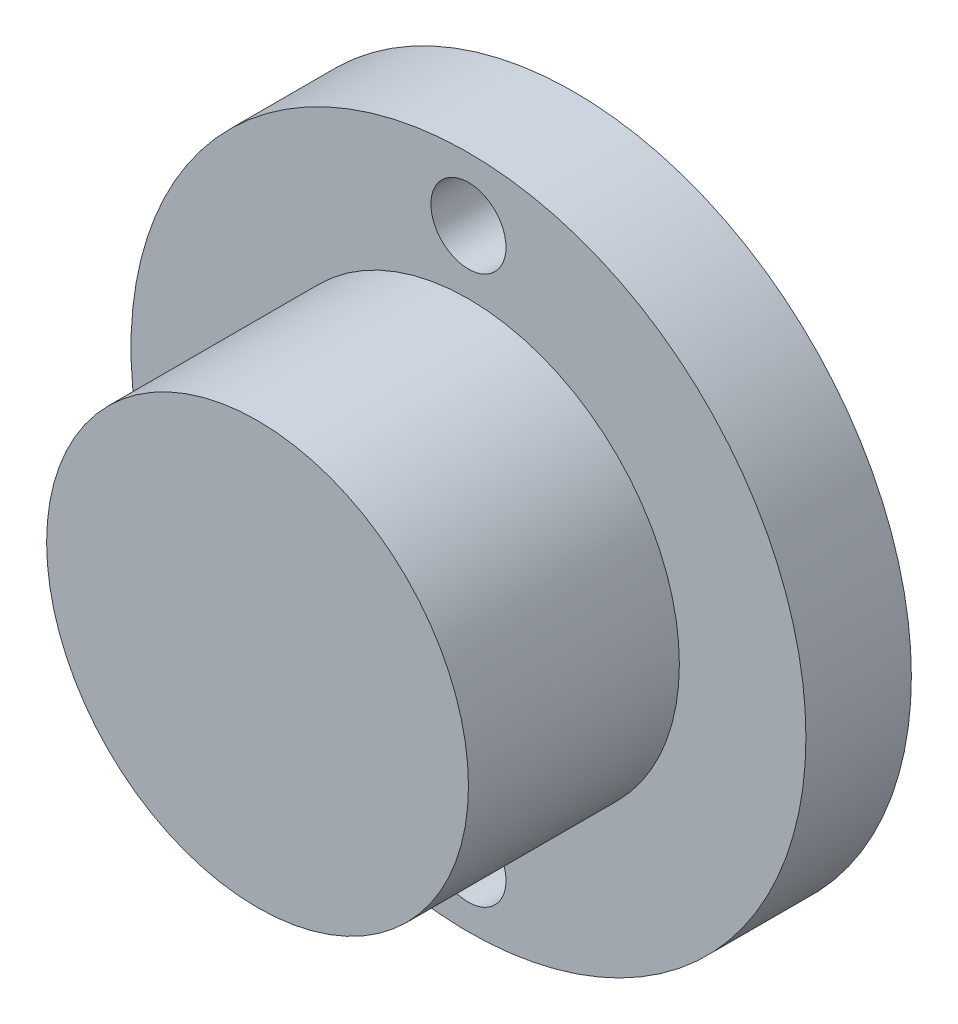
ISO-10303-21;
HEADER;
FILE_DESCRIPTION(('STEP AP214'),'2;1');
FILE_NAME('part.step','',(''),(''),'','','');
FILE_SCHEMA(('AUTOMOTIVE_DESIGN { 1 0 10303 214 1 1 1 1 }'));
ENDSEC;
DATA;
#1=APPLICATION_CONTEXT('core data for automotive mechanical design processes');
#2=APPLICATION_PROTOCOL_DEFINITION('international standard','automotive_design',2000,#1);
#3=PRODUCT_CONTEXT('',#1,'mechanical');
#4=PRODUCT('Part','Part','',(#3));
#5=PRODUCT_RELATED_PRODUCT_CATEGORY('part','',(#4));
#6=PRODUCT_DEFINITION_FORMATION('','',#4);
#7=PRODUCT_DEFINITION_CONTEXT('part definition',#1,'design');
#8=PRODUCT_DEFINITION('design','',#6,#7);
#9=PRODUCT_DEFINITION_SHAPE('','',#8);
#10=(LENGTH_UNIT() NAMED_UNIT(*) SI_UNIT(.MILLI.,.METRE.));
#11=(NAMED_UNIT(*) PLANE_ANGLE_UNIT() SI_UNIT($,.RADIAN.));
#12=(NAMED_UNIT(*) SI_UNIT($,.STERADIAN.) SOLID_ANGLE_UNIT());
#13=UNCERTAINTY_MEASURE_WITH_UNIT(LENGTH_MEASURE(1.E-05),#10,'distance_accuracy_value','');
#14=(GEOMETRIC_REPRESENTATION_CONTEXT(3) GLOBAL_UNCERTAINTY_ASSIGNED_CONTEXT((#13)) GLOBAL_UNIT_ASSIGNED_CONTEXT((#10,
#11,#12)) REPRESENTATION_CONTEXT('',''));
#15=CARTESIAN_POINT('',(0.,0.,0.));
#16=DIRECTION('',(0.,0.,1.));
#17=DIRECTION('',(1.,0.,0.));
#18=AXIS2_PLACEMENT_3D('',#15,#16,#17);
#19=CARTESIAN_POINT('',(0.,0.,3.175));
#20=DIRECTION('',(0.,0.,-1.));
#21=DIRECTION('',(-1.,0.,0.));
#22=AXIS2_PLACEMENT_3D('',#19,#20,#21);
#23=CYLINDRICAL_SURFACE('',#22,10.16);
#24=CARTESIAN_POINT('',(0.,0.,3.175));
#25=DIRECTION('',(0.,0.,1.));
#26=DIRECTION('',(1.,0.,0.));
#27=AXIS2_PLACEMENT_3D('',#24,#25,#26);
#28=CIRCLE('',#27,10.16);
#29=CARTESIAN_POINT('',(10.16,0.,3.175));
#30=VERTEX_POINT('',#29);
#31=EDGE_CURVE('E38',#30,#30,#28,.T.);
#32=ORIENTED_EDGE('',*,*,#31,.F.);
#33=EDGE_LOOP('',(#32));
#34=FACE_BOUND('',#33,.T.);
#35=CARTESIAN_POINT('',(0.,0.,0.));
#36=DIRECTION('',(0.,0.,1.));
#37=DIRECTION('',(1.,0.,0.));
#38=AXIS2_PLACEMENT_3D('',#35,#36,#37);
#39=CIRCLE('',#38,10.16);
#40=CARTESIAN_POINT('',(10.16,0.,0.));
#41=VERTEX_POINT('',#40);
#42=EDGE_CURVE('E34',#41,#41,#39,.T.);
#43=ORIENTED_EDGE('',*,*,#42,.T.);
#44=EDGE_LOOP('',(#43));
#45=FACE_BOUND('',#44,.T.);
#46=ADVANCED_FACE('F31',(#34,#45),#23,.T.);
#47=CARTESIAN_POINT('',(0.,0.,3.175));
#48=DIRECTION('',(0.,0.,1.));
#49=DIRECTION('',(1.,0.,0.));
#50=AXIS2_PLACEMENT_3D('',#47,#48,#49);
#51=PLANE('',#50);
#52=CARTESIAN_POINT('',(0.,8.255,3.175));
#53=DIRECTION('',(0.,0.,1.));
#54=DIRECTION('',(1.,0.,0.));
#55=AXIS2_PLACEMENT_3D('',#52,#53,#54);
#56=CIRCLE('',#55,1.1303);
#57=CARTESIAN_POINT('',(1.1303,8.255,3.175));
#58=VERTEX_POINT('',#57);
#59=EDGE_CURVE('E60',#58,#58,#56,.T.);
#60=ORIENTED_EDGE('',*,*,#59,.F.);
#61=EDGE_LOOP('',(#60));
#62=FACE_BOUND('',#61,.T.);
#63=CARTESIAN_POINT('',(0.,-8.255,3.175));
#64=DIRECTION('',(0.,0.,1.));
#65=DIRECTION('',(1.,0.,0.));
#66=AXIS2_PLACEMENT_3D('',#63,#64,#65);
#67=CIRCLE('',#66,1.1303);
#68=CARTESIAN_POINT('',(1.1303,-8.255,3.175));
#69=VERTEX_POINT('',#68);
#70=EDGE_CURVE('E54',#69,#69,#67,.T.);
#71=ORIENTED_EDGE('',*,*,#70,.F.);
#72=EDGE_LOOP('',(#71));
#73=FACE_BOUND('',#72,.T.);
#74=CARTESIAN_POINT('',(0.,0.,3.175));
#75=DIRECTION('',(0.,0.,1.));
#76=DIRECTION('',(1.,0.,0.));
#77=AXIS2_PLACEMENT_3D('',#74,#75,#76);
#78=CIRCLE('',#77,6.35);
#79=CARTESIAN_POINT('',(6.35,0.,3.175));
#80=VERTEX_POINT('',#79);
#81=EDGE_CURVE('E10',#80,#80,#78,.T.);
#82=ORIENTED_EDGE('',*,*,#81,.F.);
#83=EDGE_LOOP('',(#82));
#84=FACE_BOUND('',#83,.T.);
#85=ORIENTED_EDGE('',*,*,#31,.T.);
#86=EDGE_LOOP('',(#85));
#87=FACE_BOUND('',#86,.T.);
#88=ADVANCED_FACE('F76',(#62,#73,#84,#87),#51,.T.);
#89=CARTESIAN_POINT('',(0.,0.,0.));
#90=DIRECTION('',(0.,0.,1.));
#91=DIRECTION('',(1.,0.,0.));
#92=AXIS2_PLACEMENT_3D('',#89,#90,#91);
#93=PLANE('',#92);
#94=CARTESIAN_POINT('',(0.,8.255,0.));
#95=DIRECTION('',(0.,0.,1.));
#96=DIRECTION('',(1.,0.,0.));
#97=AXIS2_PLACEMENT_3D('',#94,#95,#96);
#98=CIRCLE('',#97,1.1303);
#99=CARTESIAN_POINT('',(1.1303,8.255,0.));
#100=VERTEX_POINT('',#99);
#101=EDGE_CURVE('E51',#100,#100,#98,.T.);
#102=ORIENTED_EDGE('',*,*,#101,.T.);
#103=EDGE_LOOP('',(#102));
#104=FACE_BOUND('',#103,.T.);
#105=CARTESIAN_POINT('',(0.,-8.255,0.));
#106=DIRECTION('',(0.,0.,1.));
#107=DIRECTION('',(1.,0.,0.));
#108=AXIS2_PLACEMENT_3D('',#105,#106,#107);
#109=CIRCLE('',#108,1.1303);
#110=CARTESIAN_POINT('',(1.1303,-8.255,0.));
#111=VERTEX_POINT('',#110);
#112=EDGE_CURVE('E57',#111,#111,#109,.T.);
#113=ORIENTED_EDGE('',*,*,#112,.T.);
#114=EDGE_LOOP('',(#113));
#115=FACE_BOUND('',#114,.T.);
#116=CARTESIAN_POINT('',(0.,0.,0.));
#117=DIRECTION('',(0.,0.,-1.));
#118=DIRECTION('',(-1.,0.,0.));
#119=AXIS2_PLACEMENT_3D('',#116,#117,#118);
#120=CIRCLE('',#119,4.7625);
#121=CARTESIAN_POINT('',(-4.7625,0.,0.));
#122=VERTEX_POINT('',#121);
#123=EDGE_CURVE('E48',#122,#122,#120,.T.);
#124=ORIENTED_EDGE('',*,*,#123,.F.);
#125=EDGE_LOOP('',(#124));
#126=FACE_BOUND('',#125,.T.);
#127=ORIENTED_EDGE('',*,*,#42,.F.);
#128=EDGE_LOOP('',(#127));
#129=FACE_BOUND('',#128,.T.);
#130=ADVANCED_FACE('F66',(#104,#115,#126,#129),#93,.F.);
#131=CARTESIAN_POINT('',(0.,0.,9.525));
#132=DIRECTION('',(0.,0.,-1.));
#133=DIRECTION('',(-1.,0.,0.));
#134=AXIS2_PLACEMENT_3D('',#131,#132,#133);
#135=CYLINDRICAL_SURFACE('',#134,6.35);
#136=CARTESIAN_POINT('',(0.,0.,9.525));
#137=DIRECTION('',(0.,0.,1.));
#138=DIRECTION('',(1.,0.,0.));
#139=AXIS2_PLACEMENT_3D('',#136,#137,#138);
#140=CIRCLE('',#139,6.35);
#141=CARTESIAN_POINT('',(6.35,0.,9.525));
#142=VERTEX_POINT('',#141);
#143=EDGE_CURVE('E44',#142,#142,#140,.T.);
#144=ORIENTED_EDGE('',*,*,#143,.F.);
#145=EDGE_LOOP('',(#144));
#146=FACE_BOUND('',#145,.T.);
#147=ORIENTED_EDGE('',*,*,#81,.T.);
#148=EDGE_LOOP('',(#147));
#149=FACE_BOUND('',#148,.T.);
#150=ADVANCED_FACE('F91',(#146,#149),#135,.T.);
#151=CARTESIAN_POINT('',(0.,0.,9.525));
#152=DIRECTION('',(0.,0.,1.));
#153=DIRECTION('',(1.,0.,0.));
#154=AXIS2_PLACEMENT_3D('',#151,#152,#153);
#155=PLANE('',#154);
#156=ORIENTED_EDGE('',*,*,#143,.T.);
#157=EDGE_LOOP('',(#156));
#158=FACE_BOUND('',#157,.T.);
#159=ADVANCED_FACE('F95',(#158),#155,.T.);
#160=CARTESIAN_POINT('',(0.,0.,6.35));
#161=DIRECTION('',(0.,0.,-1.));
#162=DIRECTION('',(-1.,0.,0.));
#163=AXIS2_PLACEMENT_3D('',#160,#161,#162);
#164=CYLINDRICAL_SURFACE('',#163,4.7625);
#165=CARTESIAN_POINT('',(0.,0.,6.35));
#166=DIRECTION('',(0.,0.,-1.));
#167=DIRECTION('',(-1.,0.,0.));
#168=AXIS2_PLACEMENT_3D('',#165,#166,#167);
#169=CIRCLE('',#168,4.7625);
#170=CARTESIAN_POINT('',(-4.7625,0.,6.35));
#171=VERTEX_POINT('',#170);
#172=EDGE_CURVE('E47',#171,#171,#169,.T.);
#173=ORIENTED_EDGE('',*,*,#172,.F.);
#174=EDGE_LOOP('',(#173));
#175=FACE_BOUND('',#174,.T.);
#176=ORIENTED_EDGE('',*,*,#123,.T.);
#177=EDGE_LOOP('',(#176));
#178=FACE_BOUND('',#177,.T.);
#179=ADVANCED_FACE('F101',(#175,#178),#164,.F.);
#180=CARTESIAN_POINT('',(0.,0.,6.35));
#181=DIRECTION('',(0.,0.,-1.));
#182=DIRECTION('',(-1.,0.,0.));
#183=AXIS2_PLACEMENT_3D('',#180,#181,#182);
#184=PLANE('',#183);
#185=ORIENTED_EDGE('',*,*,#172,.T.);
#186=EDGE_LOOP('',(#185));
#187=FACE_BOUND('',#186,.T.);
#188=ADVANCED_FACE('F105',(#187),#184,.T.);
#189=CARTESIAN_POINT('',(0.,-8.255,0.));
#190=DIRECTION('',(0.,0.,1.));
#191=DIRECTION('',(1.,0.,0.));
#192=AXIS2_PLACEMENT_3D('',#189,#190,#191);
#193=CYLINDRICAL_SURFACE('',#192,1.1303);
#194=ORIENTED_EDGE('',*,*,#112,.F.);
#195=EDGE_LOOP('',(#194));
#196=FACE_BOUND('',#195,.T.);
#197=ORIENTED_EDGE('',*,*,#70,.T.);
#198=EDGE_LOOP('',(#197));
#199=FACE_BOUND('',#198,.T.);
#200=ADVANCED_FACE('F72',(#196,#199),#193,.F.);
#201=CARTESIAN_POINT('',(0.,8.255,0.));
#202=DIRECTION('',(0.,0.,1.));
#203=DIRECTION('',(1.,0.,0.));
#204=AXIS2_PLACEMENT_3D('',#201,#202,#203);
#205=CYLINDRICAL_SURFACE('',#204,1.1303);
#206=ORIENTED_EDGE('',*,*,#101,.F.);
#207=EDGE_LOOP('',(#206));
#208=FACE_BOUND('',#207,.T.);
#209=ORIENTED_EDGE('',*,*,#59,.T.);
#210=EDGE_LOOP('',(#209));
#211=FACE_BOUND('',#210,.T.);
#212=ADVANCED_FACE('F69',(#208,#211),#205,.F.);
#213=CLOSED_SHELL('',(#46,#88,#130,#150,#159,#179,#188,#200,#212));
#214=MANIFOLD_SOLID_BREP('B2',#213);
#215=ADVANCED_BREP_SHAPE_REPRESENTATION('',(#18,#214),#14);
#216=SHAPE_DEFINITION_REPRESENTATION(#9,#215);
ENDSEC;
END-ISO-10303-21;
